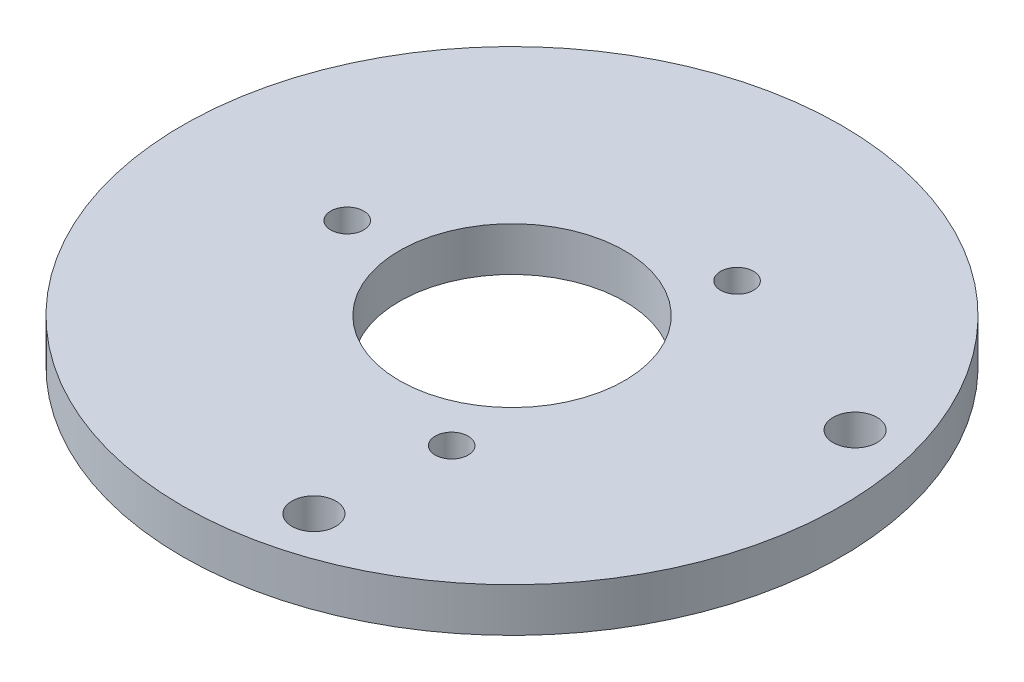
ISO-10303-21;
HEADER;
FILE_DESCRIPTION(('STEP AP214'),'2;1');
FILE_NAME('part.step','',(''),(''),'','','');
FILE_SCHEMA(('AUTOMOTIVE_DESIGN { 1 0 10303 214 1 1 1 1 }'));
ENDSEC;
DATA;
#1=APPLICATION_CONTEXT('core data for automotive mechanical design processes');
#2=APPLICATION_PROTOCOL_DEFINITION('international standard','automotive_design',2000,#1);
#3=PRODUCT_CONTEXT('',#1,'mechanical');
#4=PRODUCT('Part','Part','',(#3));
#5=PRODUCT_RELATED_PRODUCT_CATEGORY('part','',(#4));
#6=PRODUCT_DEFINITION_FORMATION('','',#4);
#7=PRODUCT_DEFINITION_CONTEXT('part definition',#1,'design');
#8=PRODUCT_DEFINITION('design','',#6,#7);
#9=PRODUCT_DEFINITION_SHAPE('','',#8);
#10=(LENGTH_UNIT() NAMED_UNIT(*) SI_UNIT(.MILLI.,.METRE.));
#11=(NAMED_UNIT(*) PLANE_ANGLE_UNIT() SI_UNIT($,.RADIAN.));
#12=(NAMED_UNIT(*) SI_UNIT($,.STERADIAN.) SOLID_ANGLE_UNIT());
#13=UNCERTAINTY_MEASURE_WITH_UNIT(LENGTH_MEASURE(1.E-05),#10,'distance_accuracy_value','');
#14=(GEOMETRIC_REPRESENTATION_CONTEXT(3) GLOBAL_UNCERTAINTY_ASSIGNED_CONTEXT((#13)) GLOBAL_UNIT_ASSIGNED_CONTEXT((#10,
#11,#12)) REPRESENTATION_CONTEXT('',''));
#15=CARTESIAN_POINT('',(0.,0.,0.));
#16=DIRECTION('',(0.,0.,1.));
#17=DIRECTION('',(1.,0.,0.));
#18=AXIS2_PLACEMENT_3D('',#15,#16,#17);
#19=CARTESIAN_POINT('',(0.,4.,0.));
#20=DIRECTION('',(0.,-1.,0.));
#21=DIRECTION('',(0.,0.,-1.));
#22=AXIS2_PLACEMENT_3D('',#19,#20,#21);
#23=CYLINDRICAL_SURFACE('',#22,30.);
#24=CARTESIAN_POINT('',(0.,0.,0.));
#25=DIRECTION('',(0.,1.,0.));
#26=DIRECTION('',(0.,0.,-1.));
#27=AXIS2_PLACEMENT_3D('',#24,#25,#26);
#28=CIRCLE('',#27,30.);
#29=CARTESIAN_POINT('',(0.,0.,-30.));
#30=VERTEX_POINT('',#29);
#31=EDGE_CURVE('E33',#30,#30,#28,.T.);
#32=ORIENTED_EDGE('',*,*,#31,.T.);
#33=EDGE_LOOP('',(#32));
#34=FACE_BOUND('',#33,.T.);
#35=CARTESIAN_POINT('',(0.,4.,0.));
#36=DIRECTION('',(0.,1.,0.));
#37=DIRECTION('',(0.,0.,1.));
#38=AXIS2_PLACEMENT_3D('',#35,#36,#37);
#39=CIRCLE('',#38,30.);
#40=CARTESIAN_POINT('',(0.,4.,30.));
#41=VERTEX_POINT('',#40);
#42=EDGE_CURVE('E10',#41,#41,#39,.T.);
#43=ORIENTED_EDGE('',*,*,#42,.F.);
#44=EDGE_LOOP('',(#43));
#45=FACE_BOUND('',#44,.T.);
#46=ADVANCED_FACE('F30',(#34,#45),#23,.T.);
#47=CARTESIAN_POINT('',(0.,4.,0.));
#48=DIRECTION('',(0.,1.,0.));
#49=DIRECTION('',(0.,0.,1.));
#50=AXIS2_PLACEMENT_3D('',#47,#48,#49);
#51=PLANE('',#50);
#52=CARTESIAN_POINT('',(24.6311074048224,4.,-6.59989000000009));
#53=DIRECTION('',(0.,1.,0.));
#54=DIRECTION('',(1.,0.,0.));
#55=AXIS2_PLACEMENT_3D('',#52,#53,#54);
#56=CIRCLE('',#55,2.00000000000001);
#57=CARTESIAN_POINT('',(26.6311074048224,4.,-6.59989000000009));
#58=VERTEX_POINT('',#57);
#59=EDGE_CURVE('E72',#58,#58,#56,.T.);
#60=ORIENTED_EDGE('',*,*,#59,.F.);
#61=EDGE_LOOP('',(#60));
#62=FACE_BOUND('',#61,.T.);
#63=CARTESIAN_POINT('',(6.59989,4.,24.6311074048225));
#64=DIRECTION('',(0.,1.,0.));
#65=DIRECTION('',(0.,0.,1.));
#66=AXIS2_PLACEMENT_3D('',#63,#64,#65);
#67=CIRCLE('',#66,2.00000000000001);
#68=CARTESIAN_POINT('',(6.59989,4.,26.6311074048225));
#69=VERTEX_POINT('',#68);
#70=EDGE_CURVE('E66',#69,#69,#67,.T.);
#71=ORIENTED_EDGE('',*,*,#70,.F.);
#72=EDGE_LOOP('',(#71));
#73=FACE_BOUND('',#72,.T.);
#74=CARTESIAN_POINT('',(0.,4.,0.));
#75=DIRECTION('',(0.,1.,0.));
#76=DIRECTION('',(0.,0.,1.));
#77=AXIS2_PLACEMENT_3D('',#74,#75,#76);
#78=CIRCLE('',#77,10.25);
#79=CARTESIAN_POINT('',(0.,4.,10.25));
#80=VERTEX_POINT('',#79);
#81=EDGE_CURVE('E60',#80,#80,#78,.T.);
#82=ORIENTED_EDGE('',*,*,#81,.F.);
#83=EDGE_LOOP('',(#82));
#84=FACE_BOUND('',#83,.T.);
#85=CARTESIAN_POINT('',(-15.,4.,0.));
#86=DIRECTION('',(0.,1.,0.));
#87=DIRECTION('',(0.866025403784436,0.,-0.500000000000004));
#88=AXIS2_PLACEMENT_3D('',#85,#86,#87);
#89=CIRCLE('',#88,1.5);
#90=CARTESIAN_POINT('',(-13.7009618943233,4.,-0.749999999999936));
#91=VERTEX_POINT('',#90);
#92=EDGE_CURVE('E55',#91,#91,#89,.T.);
#93=ORIENTED_EDGE('',*,*,#92,.F.);
#94=EDGE_LOOP('',(#93));
#95=FACE_BOUND('',#94,.T.);
#96=CARTESIAN_POINT('',(7.50000000000012,4.,12.9903810567665));
#97=DIRECTION('',(0.,1.,0.));
#98=DIRECTION('',(-0.866025403784443,0.,-0.499999999999992));
#99=AXIS2_PLACEMENT_3D('',#96,#97,#98);
#100=CIRCLE('',#99,1.5);
#101=CARTESIAN_POINT('',(6.20096189432345,4.,12.2403810567665));
#102=VERTEX_POINT('',#101);
#103=EDGE_CURVE('E48',#102,#102,#100,.T.);
#104=ORIENTED_EDGE('',*,*,#103,.F.);
#105=EDGE_LOOP('',(#104));
#106=FACE_BOUND('',#105,.T.);
#107=CARTESIAN_POINT('',(7.5,4.,-12.9903810567666));
#108=DIRECTION('',(0.,1.,0.));
#109=DIRECTION('',(0.,0.,1.));
#110=AXIS2_PLACEMENT_3D('',#107,#108,#109);
#111=CIRCLE('',#110,1.5);
#112=CARTESIAN_POINT('',(7.5,4.,-11.4903810567666));
#113=VERTEX_POINT('',#112);
#114=EDGE_CURVE('E42',#113,#113,#111,.T.);
#115=ORIENTED_EDGE('',*,*,#114,.F.);
#116=EDGE_LOOP('',(#115));
#117=FACE_BOUND('',#116,.T.);
#118=ORIENTED_EDGE('',*,*,#42,.T.);
#119=EDGE_LOOP('',(#118));
#120=FACE_BOUND('',#119,.T.);
#121=ADVANCED_FACE('F88',(#62,#73,#84,#95,#106,#117,#120),#51,.T.);
#122=CARTESIAN_POINT('',(0.,0.,0.));
#123=DIRECTION('',(0.,1.,0.));
#124=DIRECTION('',(0.,0.,1.));
#125=AXIS2_PLACEMENT_3D('',#122,#123,#124);
#126=PLANE('',#125);
#127=CARTESIAN_POINT('',(24.6311074048224,0.,-6.59989000000009));
#128=DIRECTION('',(0.,1.,0.));
#129=DIRECTION('',(1.,0.,0.));
#130=AXIS2_PLACEMENT_3D('',#127,#128,#129);
#131=CIRCLE('',#130,2.00000000000001);
#132=CARTESIAN_POINT('',(26.6311074048224,0.,-6.59989000000009));
#133=VERTEX_POINT('',#132);
#134=EDGE_CURVE('E69',#133,#133,#131,.T.);
#135=ORIENTED_EDGE('',*,*,#134,.T.);
#136=EDGE_LOOP('',(#135));
#137=FACE_BOUND('',#136,.T.);
#138=CARTESIAN_POINT('',(6.59989,0.,24.6311074048225));
#139=DIRECTION('',(0.,1.,0.));
#140=DIRECTION('',(0.,0.,1.));
#141=AXIS2_PLACEMENT_3D('',#138,#139,#140);
#142=CIRCLE('',#141,2.00000000000001);
#143=CARTESIAN_POINT('',(6.59989,0.,26.6311074048225));
#144=VERTEX_POINT('',#143);
#145=EDGE_CURVE('E63',#144,#144,#142,.T.);
#146=ORIENTED_EDGE('',*,*,#145,.T.);
#147=EDGE_LOOP('',(#146));
#148=FACE_BOUND('',#147,.T.);
#149=CARTESIAN_POINT('',(0.,0.,0.));
#150=DIRECTION('',(0.,1.,0.));
#151=DIRECTION('',(0.,0.,1.));
#152=AXIS2_PLACEMENT_3D('',#149,#150,#151);
#153=CIRCLE('',#152,10.25);
#154=CARTESIAN_POINT('',(0.,0.,10.25));
#155=VERTEX_POINT('',#154);
#156=EDGE_CURVE('E52',#155,#155,#153,.T.);
#157=ORIENTED_EDGE('',*,*,#156,.T.);
#158=EDGE_LOOP('',(#157));
#159=FACE_BOUND('',#158,.T.);
#160=CARTESIAN_POINT('',(-15.,0.,0.));
#161=DIRECTION('',(0.,1.,0.));
#162=DIRECTION('',(0.866025403784436,0.,-0.500000000000004));
#163=AXIS2_PLACEMENT_3D('',#160,#161,#162);
#164=CIRCLE('',#163,1.5);
#165=CARTESIAN_POINT('',(-13.7009618943233,0.,-0.749999999999936));
#166=VERTEX_POINT('',#165);
#167=EDGE_CURVE('E45',#166,#166,#164,.T.);
#168=ORIENTED_EDGE('',*,*,#167,.T.);
#169=EDGE_LOOP('',(#168));
#170=FACE_BOUND('',#169,.T.);
#171=CARTESIAN_POINT('',(7.50000000000012,0.,12.9903810567665));
#172=DIRECTION('',(0.,1.,0.));
#173=DIRECTION('',(-0.866025403784443,0.,-0.499999999999992));
#174=AXIS2_PLACEMENT_3D('',#171,#172,#173);
#175=CIRCLE('',#174,1.5);
#176=CARTESIAN_POINT('',(6.20096189432345,0.,12.2403810567665));
#177=VERTEX_POINT('',#176);
#178=EDGE_CURVE('E51',#177,#177,#175,.T.);
#179=ORIENTED_EDGE('',*,*,#178,.T.);
#180=EDGE_LOOP('',(#179));
#181=FACE_BOUND('',#180,.T.);
#182=CARTESIAN_POINT('',(7.5,0.,-12.9903810567666));
#183=DIRECTION('',(0.,1.,0.));
#184=DIRECTION('',(0.,0.,1.));
#185=AXIS2_PLACEMENT_3D('',#182,#183,#184);
#186=CIRCLE('',#185,1.5);
#187=CARTESIAN_POINT('',(7.5,0.,-11.4903810567666));
#188=VERTEX_POINT('',#187);
#189=EDGE_CURVE('E40',#188,#188,#186,.T.);
#190=ORIENTED_EDGE('',*,*,#189,.T.);
#191=EDGE_LOOP('',(#190));
#192=FACE_BOUND('',#191,.T.);
#193=ORIENTED_EDGE('',*,*,#31,.F.);
#194=EDGE_LOOP('',(#193));
#195=FACE_BOUND('',#194,.T.);
#196=ADVANCED_FACE('F78',(#137,#148,#159,#170,#181,#192,#195),#126,.F.);
#197=CARTESIAN_POINT('',(7.5,0.,-12.9903810567666));
#198=DIRECTION('',(0.,1.,0.));
#199=DIRECTION('',(0.,0.,1.));
#200=AXIS2_PLACEMENT_3D('',#197,#198,#199);
#201=CYLINDRICAL_SURFACE('',#200,1.5);
#202=ORIENTED_EDGE('',*,*,#189,.F.);
#203=EDGE_LOOP('',(#202));
#204=FACE_BOUND('',#203,.T.);
#205=ORIENTED_EDGE('',*,*,#114,.T.);
#206=EDGE_LOOP('',(#205));
#207=FACE_BOUND('',#206,.T.);
#208=ADVANCED_FACE('F102',(#204,#207),#201,.F.);
#209=CARTESIAN_POINT('',(7.50000000000012,0.,12.9903810567665));
#210=DIRECTION('',(0.,1.,0.));
#211=DIRECTION('',(0.,0.,1.));
#212=AXIS2_PLACEMENT_3D('',#209,#210,#211);
#213=CYLINDRICAL_SURFACE('',#212,1.5);
#214=ORIENTED_EDGE('',*,*,#178,.F.);
#215=EDGE_LOOP('',(#214));
#216=FACE_BOUND('',#215,.T.);
#217=ORIENTED_EDGE('',*,*,#103,.T.);
#218=EDGE_LOOP('',(#217));
#219=FACE_BOUND('',#218,.T.);
#220=ADVANCED_FACE('F104',(#216,#219),#213,.F.);
#221=CARTESIAN_POINT('',(-15.,0.,0.));
#222=DIRECTION('',(0.,1.,0.));
#223=DIRECTION('',(0.,0.,1.));
#224=AXIS2_PLACEMENT_3D('',#221,#222,#223);
#225=CYLINDRICAL_SURFACE('',#224,1.5);
#226=ORIENTED_EDGE('',*,*,#167,.F.);
#227=EDGE_LOOP('',(#226));
#228=FACE_BOUND('',#227,.T.);
#229=ORIENTED_EDGE('',*,*,#92,.T.);
#230=EDGE_LOOP('',(#229));
#231=FACE_BOUND('',#230,.T.);
#232=ADVANCED_FACE('F111',(#228,#231),#225,.F.);
#233=CARTESIAN_POINT('',(0.,0.,0.));
#234=DIRECTION('',(0.,1.,0.));
#235=DIRECTION('',(0.,0.,1.));
#236=AXIS2_PLACEMENT_3D('',#233,#234,#235);
#237=CYLINDRICAL_SURFACE('',#236,10.25);
#238=ORIENTED_EDGE('',*,*,#156,.F.);
#239=EDGE_LOOP('',(#238));
#240=FACE_BOUND('',#239,.T.);
#241=ORIENTED_EDGE('',*,*,#81,.T.);
#242=EDGE_LOOP('',(#241));
#243=FACE_BOUND('',#242,.T.);
#244=ADVANCED_FACE('F146',(#240,#243),#237,.F.);
#245=CARTESIAN_POINT('',(6.59989,0.,24.6311074048225));
#246=DIRECTION('',(0.,1.,0.));
#247=DIRECTION('',(0.,0.,1.));
#248=AXIS2_PLACEMENT_3D('',#245,#246,#247);
#249=CYLINDRICAL_SURFACE('',#248,2.00000000000001);
#250=ORIENTED_EDGE('',*,*,#145,.F.);
#251=EDGE_LOOP('',(#250));
#252=FACE_BOUND('',#251,.T.);
#253=ORIENTED_EDGE('',*,*,#70,.T.);
#254=EDGE_LOOP('',(#253));
#255=FACE_BOUND('',#254,.T.);
#256=ADVANCED_FACE('F84',(#252,#255),#249,.F.);
#257=CARTESIAN_POINT('',(24.6311074048224,0.,-6.59989000000009));
#258=DIRECTION('',(0.,1.,0.));
#259=DIRECTION('',(0.,0.,1.));
#260=AXIS2_PLACEMENT_3D('',#257,#258,#259);
#261=CYLINDRICAL_SURFACE('',#260,2.00000000000001);
#262=ORIENTED_EDGE('',*,*,#134,.F.);
#263=EDGE_LOOP('',(#262));
#264=FACE_BOUND('',#263,.T.);
#265=ORIENTED_EDGE('',*,*,#59,.T.);
#266=EDGE_LOOP('',(#265));
#267=FACE_BOUND('',#266,.T.);
#268=ADVANCED_FACE('F81',(#264,#267),#261,.F.);
#269=CLOSED_SHELL('',(#46,#121,#196,#208,#220,#232,#244,#256,#268));
#270=MANIFOLD_SOLID_BREP('B2',#269);
#271=ADVANCED_BREP_SHAPE_REPRESENTATION('',(#18,#270),#14);
#272=SHAPE_DEFINITION_REPRESENTATION(#9,#271);
ENDSEC;
END-ISO-10303-21;
